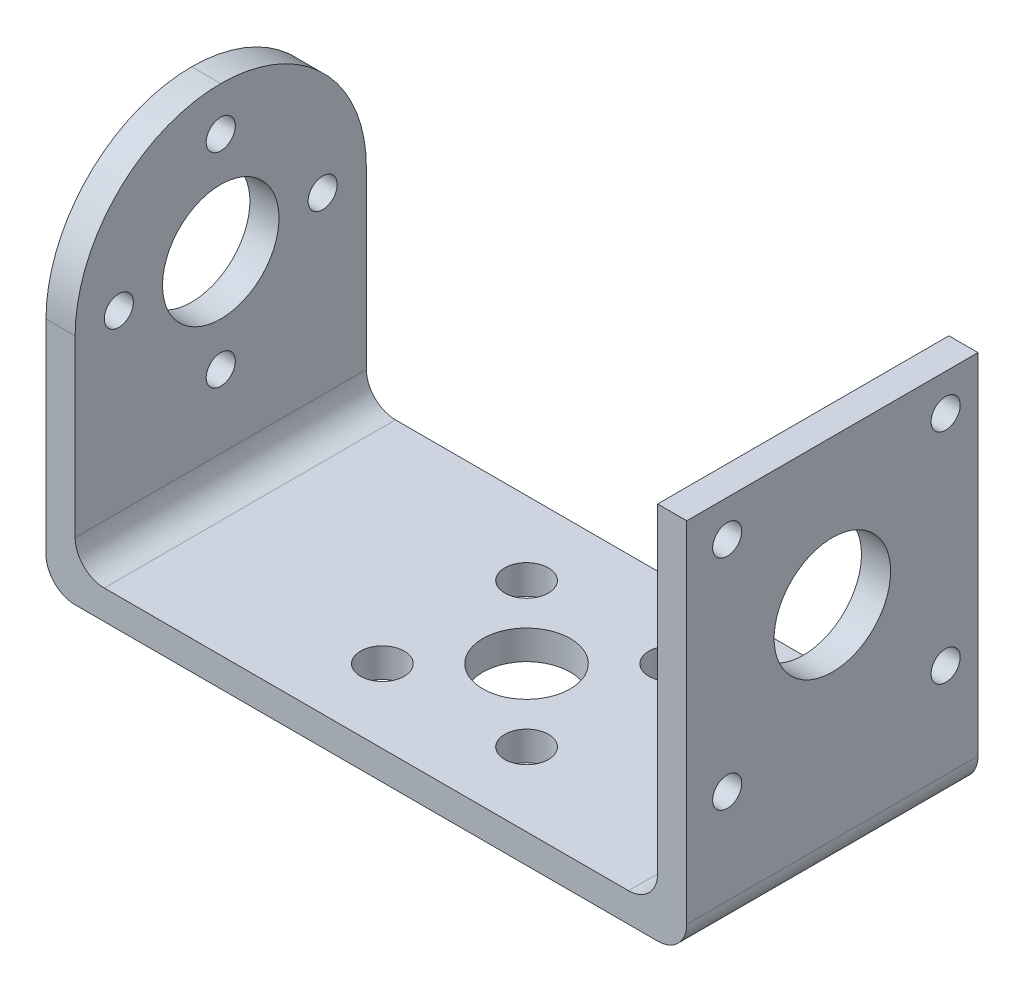
ISO-10303-21;
HEADER;
FILE_DESCRIPTION(('STEP AP214'),'2;1');
FILE_NAME('part.step','',(''),(''),'','','');
FILE_SCHEMA(('AUTOMOTIVE_DESIGN { 1 0 10303 214 1 1 1 1 }'));
ENDSEC;
DATA;
#1=APPLICATION_CONTEXT('core data for automotive mechanical design processes');
#2=APPLICATION_PROTOCOL_DEFINITION('international standard','automotive_design',2000,#1);
#3=PRODUCT_CONTEXT('',#1,'mechanical');
#4=PRODUCT('Part','Part','',(#3));
#5=PRODUCT_RELATED_PRODUCT_CATEGORY('part','',(#4));
#6=PRODUCT_DEFINITION_FORMATION('','',#4);
#7=PRODUCT_DEFINITION_CONTEXT('part definition',#1,'design');
#8=PRODUCT_DEFINITION('design','',#6,#7);
#9=PRODUCT_DEFINITION_SHAPE('','',#8);
#10=(LENGTH_UNIT() NAMED_UNIT(*) SI_UNIT(.MILLI.,.METRE.));
#11=(NAMED_UNIT(*) PLANE_ANGLE_UNIT() SI_UNIT($,.RADIAN.));
#12=(NAMED_UNIT(*) SI_UNIT($,.STERADIAN.) SOLID_ANGLE_UNIT());
#13=UNCERTAINTY_MEASURE_WITH_UNIT(LENGTH_MEASURE(1.E-05),#10,'distance_accuracy_value','');
#14=(GEOMETRIC_REPRESENTATION_CONTEXT(3) GLOBAL_UNCERTAINTY_ASSIGNED_CONTEXT((#13)) GLOBAL_UNIT_ASSIGNED_CONTEXT((#10,
#11,#12)) REPRESENTATION_CONTEXT('',''));
#15=CARTESIAN_POINT('',(0.,0.,0.));
#16=DIRECTION('',(0.,0.,1.));
#17=DIRECTION('',(1.,0.,0.));
#18=AXIS2_PLACEMENT_3D('',#15,#16,#17);
#19=CARTESIAN_POINT('',(44.0000000000001,0.,20.));
#20=DIRECTION('',(-1.,0.,0.));
#21=DIRECTION('',(0.,0.,1.));
#22=AXIS2_PLACEMENT_3D('',#19,#20,#21);
#23=PLANE('',#22);
#24=CARTESIAN_POINT('',(44.0000000000001,15.9999999999999,10.));
#25=DIRECTION('',(1.,0.,0.));
#26=DIRECTION('',(0.,0.,-1.));
#27=AXIS2_PLACEMENT_3D('',#24,#25,#26);
#28=CIRCLE('',#27,4.);
#29=CARTESIAN_POINT('',(44.0000000000001,15.9999999999999,6.));
#30=VERTEX_POINT('',#29);
#31=EDGE_CURVE('E172',#30,#30,#28,.T.);
#32=ORIENTED_EDGE('',*,*,#31,.F.);
#33=EDGE_LOOP('',(#32));
#34=FACE_BOUND('',#33,.T.);
#35=CARTESIAN_POINT('',(44.0000000000001,23.4999999999999,2.22182540694789));
#36=DIRECTION('',(1.,0.,0.));
#37=DIRECTION('',(0.,0.,-1.));
#38=AXIS2_PLACEMENT_3D('',#35,#36,#37);
#39=CIRCLE('',#38,0.999999999999998);
#40=CARTESIAN_POINT('',(44.0000000000001,23.4999999999999,1.2218254069479));
#41=VERTEX_POINT('',#40);
#42=EDGE_CURVE('E310',#41,#41,#39,.T.);
#43=ORIENTED_EDGE('',*,*,#42,.F.);
#44=EDGE_LOOP('',(#43));
#45=FACE_BOUND('',#44,.T.);
#46=CARTESIAN_POINT('',(44.0000000000001,8.49999999999986,2.22182540694789));
#47=DIRECTION('',(1.,0.,0.));
#48=DIRECTION('',(0.,0.,-1.));
#49=AXIS2_PLACEMENT_3D('',#46,#47,#48);
#50=CIRCLE('',#49,1.00000000000007);
#51=CARTESIAN_POINT('',(44.0000000000001,8.49999999999986,1.22182540694783));
#52=VERTEX_POINT('',#51);
#53=EDGE_CURVE('E306',#52,#52,#50,.T.);
#54=ORIENTED_EDGE('',*,*,#53,.F.);
#55=EDGE_LOOP('',(#54));
#56=FACE_BOUND('',#55,.T.);
#57=CARTESIAN_POINT('',(44.0000000000001,8.49999999999986,17.2218254069478));
#58=DIRECTION('',(1.,0.,0.));
#59=DIRECTION('',(0.,0.,-1.));
#60=AXIS2_PLACEMENT_3D('',#57,#58,#59);
#61=CIRCLE('',#60,1.);
#62=CARTESIAN_POINT('',(44.0000000000001,8.49999999999986,16.2218254069478));
#63=VERTEX_POINT('',#62);
#64=EDGE_CURVE('E303',#63,#63,#61,.T.);
#65=ORIENTED_EDGE('',*,*,#64,.F.);
#66=EDGE_LOOP('',(#65));
#67=FACE_BOUND('',#66,.T.);
#68=CARTESIAN_POINT('',(44.0000000000001,23.4999999999999,17.2218254069479));
#69=DIRECTION('',(1.,0.,0.));
#70=DIRECTION('',(0.,0.,-1.));
#71=AXIS2_PLACEMENT_3D('',#68,#69,#70);
#72=CIRCLE('',#71,0.999999999999998);
#73=CARTESIAN_POINT('',(44.0000000000001,23.4999999999999,16.2218254069479));
#74=VERTEX_POINT('',#73);
#75=EDGE_CURVE('E167',#74,#74,#72,.T.);
#76=ORIENTED_EDGE('',*,*,#75,.F.);
#77=EDGE_LOOP('',(#76));
#78=FACE_BOUND('',#77,.T.);
#79=DIRECTION('',(0.,1.,0.));
#80=VECTOR('',#79,1.);
#81=CARTESIAN_POINT('',(44.0000000000001,0.,20.));
#82=LINE('',#81,#80);
#83=CARTESIAN_POINT('',(44.0000000000001,2.,20.));
#84=VERTEX_POINT('',#83);
#85=CARTESIAN_POINT('',(44.0000000000001,26.,20.));
#86=VERTEX_POINT('',#85);
#87=EDGE_CURVE('E128',#84,#86,#82,.T.);
#88=ORIENTED_EDGE('',*,*,#87,.F.);
#89=DIRECTION('',(0.,0.,-1.));
#90=VECTOR('',#89,1.);
#91=CARTESIAN_POINT('',(44.0000000000001,2.,20.));
#92=LINE('',#91,#90);
#93=CARTESIAN_POINT('',(44.0000000000001,2.,0.));
#94=VERTEX_POINT('',#93);
#95=EDGE_CURVE('E219',#84,#94,#92,.T.);
#96=ORIENTED_EDGE('',*,*,#95,.T.);
#97=DIRECTION('',(0.,1.,0.));
#98=VECTOR('',#97,1.);
#99=CARTESIAN_POINT('',(44.0000000000001,0.,0.));
#100=LINE('',#99,#98);
#101=CARTESIAN_POINT('',(44.0000000000001,26.,0.));
#102=VERTEX_POINT('',#101);
#103=EDGE_CURVE('E153',#94,#102,#100,.T.);
#104=ORIENTED_EDGE('',*,*,#103,.T.);
#105=DIRECTION('',(0.,0.,-1.));
#106=VECTOR('',#105,1.);
#107=CARTESIAN_POINT('',(44.0000000000001,26.,20.));
#108=LINE('',#107,#106);
#109=EDGE_CURVE('E146',#86,#102,#108,.T.);
#110=ORIENTED_EDGE('',*,*,#109,.F.);
#111=EDGE_LOOP('',(#88,#96,#104,#110));
#112=FACE_BOUND('',#111,.T.);
#113=ADVANCED_FACE('F34',(#34,#45,#56,#67,#78,#112),#23,.F.);
#114=CARTESIAN_POINT('',(44.0000000000001,26.,20.));
#115=DIRECTION('',(0.,-1.,0.));
#116=DIRECTION('',(0.,0.,-1.));
#117=AXIS2_PLACEMENT_3D('',#114,#115,#116);
#118=PLANE('',#117);
#119=DIRECTION('',(-1.,0.,0.));
#120=VECTOR('',#119,1.);
#121=CARTESIAN_POINT('',(44.0000000000001,26.,0.));
#122=LINE('',#121,#120);
#123=CARTESIAN_POINT('',(42.0000000000001,26.,0.));
#124=VERTEX_POINT('',#123);
#125=EDGE_CURVE('E253',#102,#124,#122,.T.);
#126=ORIENTED_EDGE('',*,*,#125,.T.);
#127=DIRECTION('',(0.,0.,-1.));
#128=VECTOR('',#127,1.);
#129=CARTESIAN_POINT('',(42.0000000000001,26.,20.));
#130=LINE('',#129,#128);
#131=CARTESIAN_POINT('',(42.0000000000001,26.,20.));
#132=VERTEX_POINT('',#131);
#133=EDGE_CURVE('E148',#132,#124,#130,.T.);
#134=ORIENTED_EDGE('',*,*,#133,.F.);
#135=DIRECTION('',(-1.,0.,0.));
#136=VECTOR('',#135,1.);
#137=CARTESIAN_POINT('',(44.0000000000001,26.,20.));
#138=LINE('',#137,#136);
#139=EDGE_CURVE('E132',#86,#132,#138,.T.);
#140=ORIENTED_EDGE('',*,*,#139,.F.);
#141=ORIENTED_EDGE('',*,*,#109,.T.);
#142=EDGE_LOOP('',(#126,#134,#140,#141));
#143=FACE_BOUND('',#142,.T.);
#144=ADVANCED_FACE('F145',(#143),#118,.F.);
#145=CARTESIAN_POINT('',(42.0000000000001,26.,20.));
#146=DIRECTION('',(1.,0.,0.));
#147=DIRECTION('',(0.,1.,0.));
#148=AXIS2_PLACEMENT_3D('',#145,#146,#147);
#149=PLANE('',#148);
#150=CARTESIAN_POINT('',(42.0000000000001,15.9999999999999,10.));
#151=DIRECTION('',(1.,0.,0.));
#152=DIRECTION('',(0.,1.,0.));
#153=AXIS2_PLACEMENT_3D('',#150,#151,#152);
#154=CIRCLE('',#153,4.);
#155=CARTESIAN_POINT('',(42.0000000000001,19.9999999999999,10.));
#156=VERTEX_POINT('',#155);
#157=EDGE_CURVE('E178',#156,#156,#154,.T.);
#158=ORIENTED_EDGE('',*,*,#157,.T.);
#159=EDGE_LOOP('',(#158));
#160=FACE_BOUND('',#159,.T.);
#161=CARTESIAN_POINT('',(42.0000000000001,23.4999999999999,2.22182540694789));
#162=DIRECTION('',(1.,0.,0.));
#163=DIRECTION('',(0.,1.,0.));
#164=AXIS2_PLACEMENT_3D('',#161,#162,#163);
#165=CIRCLE('',#164,0.999999999999998);
#166=CARTESIAN_POINT('',(42.0000000000001,24.4999999999999,2.22182540694789));
#167=VERTEX_POINT('',#166);
#168=EDGE_CURVE('E175',#167,#167,#165,.T.);
#169=ORIENTED_EDGE('',*,*,#168,.T.);
#170=EDGE_LOOP('',(#169));
#171=FACE_BOUND('',#170,.T.);
#172=CARTESIAN_POINT('',(42.0000000000001,8.49999999999986,2.22182540694789));
#173=DIRECTION('',(1.,0.,0.));
#174=DIRECTION('',(0.,1.,0.));
#175=AXIS2_PLACEMENT_3D('',#172,#173,#174);
#176=CIRCLE('',#175,1.00000000000007);
#177=CARTESIAN_POINT('',(42.0000000000001,9.49999999999993,2.22182540694789));
#178=VERTEX_POINT('',#177);
#179=EDGE_CURVE('E171',#178,#178,#176,.T.);
#180=ORIENTED_EDGE('',*,*,#179,.T.);
#181=EDGE_LOOP('',(#180));
#182=FACE_BOUND('',#181,.T.);
#183=CARTESIAN_POINT('',(42.0000000000001,8.49999999999986,17.2218254069478));
#184=DIRECTION('',(1.,0.,0.));
#185=DIRECTION('',(0.,1.,0.));
#186=AXIS2_PLACEMENT_3D('',#183,#184,#185);
#187=CIRCLE('',#186,1.);
#188=CARTESIAN_POINT('',(42.0000000000001,9.49999999999986,17.2218254069478));
#189=VERTEX_POINT('',#188);
#190=EDGE_CURVE('E168',#189,#189,#187,.T.);
#191=ORIENTED_EDGE('',*,*,#190,.T.);
#192=EDGE_LOOP('',(#191));
#193=FACE_BOUND('',#192,.T.);
#194=CARTESIAN_POINT('',(42.0000000000001,23.4999999999999,17.2218254069479));
#195=DIRECTION('',(1.,0.,0.));
#196=DIRECTION('',(0.,1.,0.));
#197=AXIS2_PLACEMENT_3D('',#194,#195,#196);
#198=CIRCLE('',#197,0.999999999999998);
#199=CARTESIAN_POINT('',(42.0000000000001,24.4999999999999,17.2218254069479));
#200=VERTEX_POINT('',#199);
#201=EDGE_CURVE('E163',#200,#200,#198,.T.);
#202=ORIENTED_EDGE('',*,*,#201,.T.);
#203=EDGE_LOOP('',(#202));
#204=FACE_BOUND('',#203,.T.);
#205=DIRECTION('',(0.,-1.,0.));
#206=VECTOR('',#205,1.);
#207=CARTESIAN_POINT('',(42.0000000000001,26.,0.));
#208=LINE('',#207,#206);
#209=CARTESIAN_POINT('',(42.0000000000001,3.99999999999999,0.));
#210=VERTEX_POINT('',#209);
#211=EDGE_CURVE('E234',#124,#210,#208,.T.);
#212=ORIENTED_EDGE('',*,*,#211,.T.);
#213=DIRECTION('',(0.,0.,-1.));
#214=VECTOR('',#213,1.);
#215=CARTESIAN_POINT('',(42.0000000000001,3.99999999999999,20.));
#216=LINE('',#215,#214);
#217=CARTESIAN_POINT('',(42.0000000000001,3.99999999999999,20.));
#218=VERTEX_POINT('',#217);
#219=EDGE_CURVE('E214',#210,#218,#216,.F.);
#220=ORIENTED_EDGE('',*,*,#219,.T.);
#221=DIRECTION('',(0.,-1.,0.));
#222=VECTOR('',#221,1.);
#223=CARTESIAN_POINT('',(42.0000000000001,26.,20.));
#224=LINE('',#223,#222);
#225=EDGE_CURVE('E150',#132,#218,#224,.T.);
#226=ORIENTED_EDGE('',*,*,#225,.F.);
#227=ORIENTED_EDGE('',*,*,#133,.T.);
#228=EDGE_LOOP('',(#212,#220,#226,#227));
#229=FACE_BOUND('',#228,.T.);
#230=ADVANCED_FACE('F270',(#160,#171,#182,#193,#204,#229),#149,.F.);
#231=CARTESIAN_POINT('',(1.99999999999998,1.99999999999998,20.));
#232=DIRECTION('',(0.,-1.,0.));
#233=DIRECTION('',(1.,0.,0.));
#234=AXIS2_PLACEMENT_3D('',#231,#232,#233);
#235=PLANE('',#234);
#236=CARTESIAN_POINT('',(27.9497474683058,2.,14.9497474683058));
#237=DIRECTION('',(0.,-1.,0.));
#238=DIRECTION('',(0.,0.,-1.));
#239=AXIS2_PLACEMENT_3D('',#236,#237,#238);
#240=CIRCLE('',#239,1.49999999999993);
#241=CARTESIAN_POINT('',(27.9497474683058,2.,13.4497474683059));
#242=VERTEX_POINT('',#241);
#243=EDGE_CURVE('E318',#242,#242,#240,.T.);
#244=ORIENTED_EDGE('',*,*,#243,.T.);
#245=EDGE_LOOP('',(#244));
#246=FACE_BOUND('',#245,.T.);
#247=CARTESIAN_POINT('',(18.0502525316941,2.,14.9497474683059));
#248=DIRECTION('',(0.,-1.,0.));
#249=DIRECTION('',(0.,0.,-1.));
#250=AXIS2_PLACEMENT_3D('',#247,#248,#249);
#251=CIRCLE('',#250,1.5);
#252=CARTESIAN_POINT('',(18.0502525316941,2.,13.4497474683059));
#253=VERTEX_POINT('',#252);
#254=EDGE_CURVE('E335',#253,#253,#251,.T.);
#255=ORIENTED_EDGE('',*,*,#254,.T.);
#256=EDGE_LOOP('',(#255));
#257=FACE_BOUND('',#256,.T.);
#258=CARTESIAN_POINT('',(18.0502525316941,2.,5.05025253169416));
#259=DIRECTION('',(0.,-1.,0.));
#260=DIRECTION('',(0.,0.,-1.));
#261=AXIS2_PLACEMENT_3D('',#258,#259,#260);
#262=CIRCLE('',#261,1.49999999999996);
#263=CARTESIAN_POINT('',(18.0502525316941,2.,3.5502525316942));
#264=VERTEX_POINT('',#263);
#265=EDGE_CURVE('E329',#264,#264,#262,.T.);
#266=ORIENTED_EDGE('',*,*,#265,.T.);
#267=EDGE_LOOP('',(#266));
#268=FACE_BOUND('',#267,.T.);
#269=CARTESIAN_POINT('',(27.9497474683058,2.,5.05025253169417));
#270=DIRECTION('',(0.,-1.,0.));
#271=DIRECTION('',(0.,0.,-1.));
#272=AXIS2_PLACEMENT_3D('',#269,#270,#271);
#273=CIRCLE('',#272,1.5);
#274=CARTESIAN_POINT('',(27.9497474683058,2.,3.55025253169417));
#275=VERTEX_POINT('',#274);
#276=EDGE_CURVE('E323',#275,#275,#273,.T.);
#277=ORIENTED_EDGE('',*,*,#276,.T.);
#278=EDGE_LOOP('',(#277));
#279=FACE_BOUND('',#278,.T.);
#280=CARTESIAN_POINT('',(22.9999999999999,2.,10.));
#281=DIRECTION('',(0.,-1.,0.));
#282=DIRECTION('',(0.,0.,-1.));
#283=AXIS2_PLACEMENT_3D('',#280,#281,#282);
#284=CIRCLE('',#283,3.);
#285=CARTESIAN_POINT('',(22.9999999999999,2.,7.));
#286=VERTEX_POINT('',#285);
#287=EDGE_CURVE('E307',#286,#286,#284,.T.);
#288=ORIENTED_EDGE('',*,*,#287,.T.);
#289=EDGE_LOOP('',(#288));
#290=FACE_BOUND('',#289,.T.);
#291=DIRECTION('',(-1.,0.,0.));
#292=VECTOR('',#291,1.);
#293=CARTESIAN_POINT('',(1.99999999999998,1.99999999999998,20.));
#294=LINE('',#293,#292);
#295=CARTESIAN_POINT('',(40.0000000000001,1.99999999999999,20.));
#296=VERTEX_POINT('',#295);
#297=CARTESIAN_POINT('',(3.99999999999998,1.99999999999998,20.));
#298=VERTEX_POINT('',#297);
#299=EDGE_CURVE('E240',#296,#298,#294,.T.);
#300=ORIENTED_EDGE('',*,*,#299,.F.);
#301=DIRECTION('',(0.,0.,-1.));
#302=VECTOR('',#301,1.);
#303=CARTESIAN_POINT('',(40.0000000000001,1.99999999999999,0.));
#304=LINE('',#303,#302);
#305=CARTESIAN_POINT('',(40.0000000000001,1.99999999999999,0.));
#306=VERTEX_POINT('',#305);
#307=EDGE_CURVE('E211',#296,#306,#304,.T.);
#308=ORIENTED_EDGE('',*,*,#307,.T.);
#309=DIRECTION('',(-1.,0.,0.));
#310=VECTOR('',#309,1.);
#311=CARTESIAN_POINT('',(1.99999999999998,1.99999999999998,0.));
#312=LINE('',#311,#310);
#313=CARTESIAN_POINT('',(3.99999999999998,1.99999999999998,0.));
#314=VERTEX_POINT('',#313);
#315=EDGE_CURVE('E228',#306,#314,#312,.T.);
#316=ORIENTED_EDGE('',*,*,#315,.T.);
#317=DIRECTION('',(0.,0.,-1.));
#318=VECTOR('',#317,1.);
#319=CARTESIAN_POINT('',(3.99999999999998,1.99999999999998,20.));
#320=LINE('',#319,#318);
#321=EDGE_CURVE('E49',#314,#298,#320,.F.);
#322=ORIENTED_EDGE('',*,*,#321,.T.);
#323=EDGE_LOOP('',(#300,#308,#316,#322));
#324=FACE_BOUND('',#323,.T.);
#325=ADVANCED_FACE('F232',(#246,#257,#268,#279,#290,#324),#235,.F.);
#326=CARTESIAN_POINT('',(1.99999999999998,1.99999999999998,20.));
#327=DIRECTION('',(-1.,0.,0.));
#328=DIRECTION('',(0.,0.,1.));
#329=AXIS2_PLACEMENT_3D('',#326,#327,#328);
#330=PLANE('',#329);
#331=CARTESIAN_POINT('',(1.99999999999999,16.,3.));
#332=DIRECTION('',(-1.,0.,0.));
#333=DIRECTION('',(0.,0.,1.));
#334=AXIS2_PLACEMENT_3D('',#331,#332,#333);
#335=CIRCLE('',#334,0.999999999999827);
#336=CARTESIAN_POINT('',(1.99999999999999,16.,3.99999999999982));
#337=VERTEX_POINT('',#336);
#338=EDGE_CURVE('E293',#337,#337,#335,.T.);
#339=ORIENTED_EDGE('',*,*,#338,.T.);
#340=EDGE_LOOP('',(#339));
#341=FACE_BOUND('',#340,.T.);
#342=CARTESIAN_POINT('',(1.99999999999999,8.99999999999999,10.));
#343=DIRECTION('',(-1.,0.,0.));
#344=DIRECTION('',(0.,0.,1.));
#345=AXIS2_PLACEMENT_3D('',#342,#343,#344);
#346=CIRCLE('',#345,0.99999999999967);
#347=CARTESIAN_POINT('',(1.99999999999999,8.99999999999999,10.9999999999997));
#348=VERTEX_POINT('',#347);
#349=EDGE_CURVE('E283',#348,#348,#346,.T.);
#350=ORIENTED_EDGE('',*,*,#349,.T.);
#351=EDGE_LOOP('',(#350));
#352=FACE_BOUND('',#351,.T.);
#353=CARTESIAN_POINT('',(1.99999999999999,16.,17.));
#354=DIRECTION('',(-1.,0.,0.));
#355=DIRECTION('',(0.,0.,1.));
#356=AXIS2_PLACEMENT_3D('',#353,#354,#355);
#357=CIRCLE('',#356,0.999999999999888);
#358=CARTESIAN_POINT('',(1.99999999999999,16.,17.9999999999999));
#359=VERTEX_POINT('',#358);
#360=EDGE_CURVE('E282',#359,#359,#357,.T.);
#361=ORIENTED_EDGE('',*,*,#360,.T.);
#362=EDGE_LOOP('',(#361));
#363=FACE_BOUND('',#362,.T.);
#364=CARTESIAN_POINT('',(1.99999999999999,23.,10.));
#365=DIRECTION('',(-1.,0.,0.));
#366=DIRECTION('',(0.,0.,1.));
#367=AXIS2_PLACEMENT_3D('',#364,#365,#366);
#368=CIRCLE('',#367,1.);
#369=CARTESIAN_POINT('',(1.99999999999999,23.,11.));
#370=VERTEX_POINT('',#369);
#371=EDGE_CURVE('E276',#370,#370,#368,.T.);
#372=ORIENTED_EDGE('',*,*,#371,.T.);
#373=EDGE_LOOP('',(#372));
#374=FACE_BOUND('',#373,.T.);
#375=CARTESIAN_POINT('',(1.99999999999999,16.,10.));
#376=DIRECTION('',(-1.,0.,0.));
#377=DIRECTION('',(0.,0.,1.));
#378=AXIS2_PLACEMENT_3D('',#375,#376,#377);
#379=CIRCLE('',#378,4.);
#380=CARTESIAN_POINT('',(1.99999999999999,16.,14.));
#381=VERTEX_POINT('',#380);
#382=EDGE_CURVE('E254',#381,#381,#379,.T.);
#383=ORIENTED_EDGE('',*,*,#382,.T.);
#384=EDGE_LOOP('',(#383));
#385=FACE_BOUND('',#384,.T.);
#386=DIRECTION('',(0.,1.,0.));
#387=VECTOR('',#386,1.);
#388=CARTESIAN_POINT('',(1.99999999999998,1.99999999999998,20.));
#389=LINE('',#388,#387);
#390=CARTESIAN_POINT('',(1.99999999999998,3.99999999999998,20.));
#391=VERTEX_POINT('',#390);
#392=CARTESIAN_POINT('',(1.99999999999998,16.,20.));
#393=VERTEX_POINT('',#392);
#394=EDGE_CURVE('E239',#391,#393,#389,.T.);
#395=ORIENTED_EDGE('',*,*,#394,.F.);
#396=DIRECTION('',(0.,0.,-1.));
#397=VECTOR('',#396,1.);
#398=CARTESIAN_POINT('',(1.99999999999998,3.99999999999998,0.));
#399=LINE('',#398,#397);
#400=CARTESIAN_POINT('',(1.99999999999998,3.99999999999998,0.));
#401=VERTEX_POINT('',#400);
#402=EDGE_CURVE('E216',#391,#401,#399,.T.);
#403=ORIENTED_EDGE('',*,*,#402,.T.);
#404=DIRECTION('',(0.,1.,0.));
#405=VECTOR('',#404,1.);
#406=CARTESIAN_POINT('',(1.99999999999998,1.99999999999998,0.));
#407=LINE('',#406,#405);
#408=CARTESIAN_POINT('',(1.99999999999998,16.,0.));
#409=VERTEX_POINT('',#408);
#410=EDGE_CURVE('E229',#401,#409,#407,.T.);
#411=ORIENTED_EDGE('',*,*,#410,.T.);
#412=CARTESIAN_POINT('',(1.99999999999998,16.,10.));
#413=DIRECTION('',(-1.,0.,0.));
#414=DIRECTION('',(0.,0.,1.));
#415=AXIS2_PLACEMENT_3D('',#412,#413,#414);
#416=CIRCLE('',#415,10.);
#417=CARTESIAN_POINT('',(1.99999999999998,26.,10.));
#418=VERTEX_POINT('',#417);
#419=EDGE_CURVE('E188',#409,#418,#416,.F.);
#420=ORIENTED_EDGE('',*,*,#419,.T.);
#421=CARTESIAN_POINT('',(1.99999999999998,16.,10.));
#422=DIRECTION('',(-1.,0.,0.));
#423=DIRECTION('',(0.,0.,1.));
#424=AXIS2_PLACEMENT_3D('',#421,#422,#423);
#425=CIRCLE('',#424,10.);
#426=EDGE_CURVE('E185',#418,#393,#425,.F.);
#427=ORIENTED_EDGE('',*,*,#426,.T.);
#428=EDGE_LOOP('',(#395,#403,#411,#420,#427));
#429=FACE_BOUND('',#428,.T.);
#430=ADVANCED_FACE('F242',(#341,#352,#363,#374,#385,#429),#330,.F.);
#431=CARTESIAN_POINT('',(1.11022302462516E-13,26.,20.));
#432=DIRECTION('',(1.,0.,0.));
#433=DIRECTION('',(0.,1.,0.));
#434=AXIS2_PLACEMENT_3D('',#431,#432,#433);
#435=PLANE('',#434);
#436=CARTESIAN_POINT('',(0.,16.,3.));
#437=DIRECTION('',(-1.,0.,0.));
#438=DIRECTION('',(0.,0.,1.));
#439=AXIS2_PLACEMENT_3D('',#436,#437,#438);
#440=CIRCLE('',#439,0.999999999999827);
#441=CARTESIAN_POINT('',(0.,16.,3.99999999999982));
#442=VERTEX_POINT('',#441);
#443=EDGE_CURVE('E166',#442,#442,#440,.T.);
#444=ORIENTED_EDGE('',*,*,#443,.F.);
#445=EDGE_LOOP('',(#444));
#446=FACE_BOUND('',#445,.T.);
#447=CARTESIAN_POINT('',(0.,8.99999999999999,10.));
#448=DIRECTION('',(-1.,0.,0.));
#449=DIRECTION('',(0.,0.,1.));
#450=AXIS2_PLACEMENT_3D('',#447,#448,#449);
#451=CIRCLE('',#450,0.99999999999967);
#452=CARTESIAN_POINT('',(0.,8.99999999999999,10.9999999999997));
#453=VERTEX_POINT('',#452);
#454=EDGE_CURVE('E296',#453,#453,#451,.T.);
#455=ORIENTED_EDGE('',*,*,#454,.F.);
#456=EDGE_LOOP('',(#455));
#457=FACE_BOUND('',#456,.T.);
#458=CARTESIAN_POINT('',(0.,16.,17.));
#459=DIRECTION('',(-1.,0.,0.));
#460=DIRECTION('',(0.,0.,1.));
#461=AXIS2_PLACEMENT_3D('',#458,#459,#460);
#462=CIRCLE('',#461,0.999999999999888);
#463=CARTESIAN_POINT('',(0.,16.,17.9999999999999));
#464=VERTEX_POINT('',#463);
#465=EDGE_CURVE('E279',#464,#464,#462,.T.);
#466=ORIENTED_EDGE('',*,*,#465,.F.);
#467=EDGE_LOOP('',(#466));
#468=FACE_BOUND('',#467,.T.);
#469=CARTESIAN_POINT('',(0.,23.,10.));
#470=DIRECTION('',(-1.,0.,0.));
#471=DIRECTION('',(0.,0.,1.));
#472=AXIS2_PLACEMENT_3D('',#469,#470,#471);
#473=CIRCLE('',#472,1.);
#474=CARTESIAN_POINT('',(0.,23.,11.));
#475=VERTEX_POINT('',#474);
#476=EDGE_CURVE('E286',#475,#475,#473,.T.);
#477=ORIENTED_EDGE('',*,*,#476,.F.);
#478=EDGE_LOOP('',(#477));
#479=FACE_BOUND('',#478,.T.);
#480=CARTESIAN_POINT('',(0.,16.,10.));
#481=DIRECTION('',(-1.,0.,0.));
#482=DIRECTION('',(0.,0.,1.));
#483=AXIS2_PLACEMENT_3D('',#480,#481,#482);
#484=CIRCLE('',#483,4.);
#485=CARTESIAN_POINT('',(0.,16.,14.));
#486=VERTEX_POINT('',#485);
#487=EDGE_CURVE('E273',#486,#486,#484,.T.);
#488=ORIENTED_EDGE('',*,*,#487,.F.);
#489=EDGE_LOOP('',(#488));
#490=FACE_BOUND('',#489,.T.);
#491=DIRECTION('',(0.,-1.,0.));
#492=VECTOR('',#491,1.);
#493=CARTESIAN_POINT('',(1.11022302462516E-13,26.,0.));
#494=LINE('',#493,#492);
#495=CARTESIAN_POINT('',(1.12356705136344E-13,16.,0.));
#496=VERTEX_POINT('',#495);
#497=CARTESIAN_POINT('',(1.14224868879704E-13,2.00000000000001,0.));
#498=VERTEX_POINT('',#497);
#499=EDGE_CURVE('E259',#496,#498,#494,.T.);
#500=ORIENTED_EDGE('',*,*,#499,.T.);
#501=DIRECTION('',(0.,0.,-1.));
#502=VECTOR('',#501,1.);
#503=CARTESIAN_POINT('',(1.14224868879704E-13,2.,20.));
#504=LINE('',#503,#502);
#505=CARTESIAN_POINT('',(1.14224868879704E-13,2.00000000000001,20.));
#506=VERTEX_POINT('',#505);
#507=EDGE_CURVE('E205',#498,#506,#504,.F.);
#508=ORIENTED_EDGE('',*,*,#507,.T.);
#509=DIRECTION('',(0.,-1.,0.));
#510=VECTOR('',#509,1.);
#511=CARTESIAN_POINT('',(1.11022302462516E-13,26.,20.));
#512=LINE('',#511,#510);
#513=CARTESIAN_POINT('',(1.12356705136344E-13,16.,20.));
#514=VERTEX_POINT('',#513);
#515=EDGE_CURVE('E245',#514,#506,#512,.T.);
#516=ORIENTED_EDGE('',*,*,#515,.F.);
#517=CARTESIAN_POINT('',(1.12356705136344E-13,16.,10.));
#518=DIRECTION('',(1.,0.,0.));
#519=DIRECTION('',(0.,1.,0.));
#520=AXIS2_PLACEMENT_3D('',#517,#518,#519);
#521=CIRCLE('',#520,10.);
#522=CARTESIAN_POINT('',(1.11022302462516E-13,26.,10.));
#523=VERTEX_POINT('',#522);
#524=EDGE_CURVE('E155',#514,#523,#521,.F.);
#525=ORIENTED_EDGE('',*,*,#524,.T.);
#526=CARTESIAN_POINT('',(1.12323345069498E-13,16.,10.));
#527=DIRECTION('',(1.,0.,0.));
#528=DIRECTION('',(0.,1.,0.));
#529=AXIS2_PLACEMENT_3D('',#526,#527,#528);
#530=CIRCLE('',#529,10.);
#531=EDGE_CURVE('E157',#523,#496,#530,.F.);
#532=ORIENTED_EDGE('',*,*,#531,.T.);
#533=EDGE_LOOP('',(#500,#508,#516,#525,#532));
#534=FACE_BOUND('',#533,.T.);
#535=ADVANCED_FACE('F356',(#446,#457,#468,#479,#490,#534),#435,.F.);
#536=CARTESIAN_POINT('',(1.14491749414469E-13,0.,20.));
#537=DIRECTION('',(0.,1.,0.));
#538=DIRECTION('',(0.,0.,1.));
#539=AXIS2_PLACEMENT_3D('',#536,#537,#538);
#540=PLANE('',#539);
#541=CARTESIAN_POINT('',(27.9497474683058,0.,14.9497474683058));
#542=DIRECTION('',(0.,-1.,0.));
#543=DIRECTION('',(0.,0.,-1.));
#544=AXIS2_PLACEMENT_3D('',#541,#542,#543);
#545=CIRCLE('',#544,1.49999999999993);
#546=CARTESIAN_POINT('',(27.9497474683058,0.,13.4497474683059));
#547=VERTEX_POINT('',#546);
#548=EDGE_CURVE('E338',#547,#547,#545,.T.);
#549=ORIENTED_EDGE('',*,*,#548,.F.);
#550=EDGE_LOOP('',(#549));
#551=FACE_BOUND('',#550,.T.);
#552=CARTESIAN_POINT('',(18.0502525316941,0.,14.9497474683059));
#553=DIRECTION('',(0.,-1.,0.));
#554=DIRECTION('',(0.,0.,-1.));
#555=AXIS2_PLACEMENT_3D('',#552,#553,#554);
#556=CIRCLE('',#555,1.5);
#557=CARTESIAN_POINT('',(18.0502525316941,0.,13.4497474683059));
#558=VERTEX_POINT('',#557);
#559=EDGE_CURVE('E332',#558,#558,#556,.T.);
#560=ORIENTED_EDGE('',*,*,#559,.F.);
#561=EDGE_LOOP('',(#560));
#562=FACE_BOUND('',#561,.T.);
#563=CARTESIAN_POINT('',(18.0502525316941,0.,5.05025253169416));
#564=DIRECTION('',(0.,-1.,0.));
#565=DIRECTION('',(0.,0.,-1.));
#566=AXIS2_PLACEMENT_3D('',#563,#564,#565);
#567=CIRCLE('',#566,1.49999999999996);
#568=CARTESIAN_POINT('',(18.0502525316941,0.,3.5502525316942));
#569=VERTEX_POINT('',#568);
#570=EDGE_CURVE('E326',#569,#569,#567,.T.);
#571=ORIENTED_EDGE('',*,*,#570,.F.);
#572=EDGE_LOOP('',(#571));
#573=FACE_BOUND('',#572,.T.);
#574=CARTESIAN_POINT('',(27.9497474683058,0.,5.05025253169417));
#575=DIRECTION('',(0.,-1.,0.));
#576=DIRECTION('',(0.,0.,-1.));
#577=AXIS2_PLACEMENT_3D('',#574,#575,#576);
#578=CIRCLE('',#577,1.5);
#579=CARTESIAN_POINT('',(27.9497474683058,0.,3.55025253169417));
#580=VERTEX_POINT('',#579);
#581=EDGE_CURVE('E196',#580,#580,#578,.T.);
#582=ORIENTED_EDGE('',*,*,#581,.F.);
#583=EDGE_LOOP('',(#582));
#584=FACE_BOUND('',#583,.T.);
#585=CARTESIAN_POINT('',(22.9999999999999,0.,10.));
#586=DIRECTION('',(0.,-1.,0.));
#587=DIRECTION('',(0.,0.,-1.));
#588=AXIS2_PLACEMENT_3D('',#585,#586,#587);
#589=CIRCLE('',#588,3.);
#590=CARTESIAN_POINT('',(22.9999999999999,0.,7.));
#591=VERTEX_POINT('',#590);
#592=EDGE_CURVE('E315',#591,#591,#589,.T.);
#593=ORIENTED_EDGE('',*,*,#592,.F.);
#594=EDGE_LOOP('',(#593));
#595=FACE_BOUND('',#594,.T.);
#596=DIRECTION('',(1.,0.,0.));
#597=VECTOR('',#596,1.);
#598=CARTESIAN_POINT('',(1.14491749414469E-13,0.,20.));
#599=LINE('',#598,#597);
#600=CARTESIAN_POINT('',(2.00000000000011,0.,20.));
#601=VERTEX_POINT('',#600);
#602=CARTESIAN_POINT('',(42.0000000000001,0.,20.));
#603=VERTEX_POINT('',#602);
#604=EDGE_CURVE('E159',#601,#603,#599,.T.);
#605=ORIENTED_EDGE('',*,*,#604,.F.);
#606=DIRECTION('',(0.,0.,-1.));
#607=VECTOR('',#606,1.);
#608=CARTESIAN_POINT('',(2.00000000000011,0.,20.));
#609=LINE('',#608,#607);
#610=CARTESIAN_POINT('',(2.00000000000011,0.,0.));
#611=VERTEX_POINT('',#610);
#612=EDGE_CURVE('E198',#601,#611,#609,.T.);
#613=ORIENTED_EDGE('',*,*,#612,.T.);
#614=DIRECTION('',(1.,0.,0.));
#615=VECTOR('',#614,1.);
#616=CARTESIAN_POINT('',(1.14491749414469E-13,0.,0.));
#617=LINE('',#616,#615);
#618=CARTESIAN_POINT('',(42.0000000000001,0.,0.));
#619=VERTEX_POINT('',#618);
#620=EDGE_CURVE('E141',#611,#619,#617,.T.);
#621=ORIENTED_EDGE('',*,*,#620,.T.);
#622=DIRECTION('',(0.,0.,-1.));
#623=VECTOR('',#622,1.);
#624=CARTESIAN_POINT('',(42.0000000000001,0.,20.));
#625=LINE('',#624,#623);
#626=EDGE_CURVE('E192',#619,#603,#625,.F.);
#627=ORIENTED_EDGE('',*,*,#626,.T.);
#628=EDGE_LOOP('',(#605,#613,#621,#627));
#629=FACE_BOUND('',#628,.T.);
#630=ADVANCED_FACE('F265',(#551,#562,#573,#584,#595,#629),#540,.F.);
#631=CARTESIAN_POINT('',(0.,0.,20.));
#632=DIRECTION('',(0.,0.,1.));
#633=DIRECTION('',(1.,0.,0.));
#634=AXIS2_PLACEMENT_3D('',#631,#632,#633);
#635=PLANE('',#634);
#636=ORIENTED_EDGE('',*,*,#515,.T.);
#637=CARTESIAN_POINT('',(2.00000000000011,2.,20.));
#638=DIRECTION('',(0.,0.,1.));
#639=DIRECTION('',(1.,0.,0.));
#640=AXIS2_PLACEMENT_3D('',#637,#638,#639);
#641=CIRCLE('',#640,2.);
#642=EDGE_CURVE('E208',#506,#601,#641,.T.);
#643=ORIENTED_EDGE('',*,*,#642,.T.);
#644=ORIENTED_EDGE('',*,*,#604,.T.);
#645=CARTESIAN_POINT('',(42.0000000000001,2.,20.));
#646=DIRECTION('',(0.,0.,1.));
#647=DIRECTION('',(1.,0.,0.));
#648=AXIS2_PLACEMENT_3D('',#645,#646,#647);
#649=CIRCLE('',#648,2.);
#650=EDGE_CURVE('E136',#603,#84,#649,.T.);
#651=ORIENTED_EDGE('',*,*,#650,.T.);
#652=ORIENTED_EDGE('',*,*,#87,.T.);
#653=ORIENTED_EDGE('',*,*,#139,.T.);
#654=ORIENTED_EDGE('',*,*,#225,.T.);
#655=CARTESIAN_POINT('',(40.0000000000001,3.99999999999999,20.));
#656=DIRECTION('',(0.,0.,1.));
#657=DIRECTION('',(1.,0.,0.));
#658=AXIS2_PLACEMENT_3D('',#655,#656,#657);
#659=CIRCLE('',#658,2.);
#660=EDGE_CURVE('E56',#218,#296,#659,.F.);
#661=ORIENTED_EDGE('',*,*,#660,.T.);
#662=ORIENTED_EDGE('',*,*,#299,.T.);
#663=CARTESIAN_POINT('',(3.99999999999998,3.99999999999998,20.));
#664=DIRECTION('',(0.,0.,1.));
#665=DIRECTION('',(1.,0.,0.));
#666=AXIS2_PLACEMENT_3D('',#663,#664,#665);
#667=CIRCLE('',#666,2.);
#668=EDGE_CURVE('E11',#298,#391,#667,.F.);
#669=ORIENTED_EDGE('',*,*,#668,.T.);
#670=ORIENTED_EDGE('',*,*,#394,.T.);
#671=DIRECTION('',(-1.,0.,0.));
#672=VECTOR('',#671,1.);
#673=CARTESIAN_POINT('',(1.11022302462516E-13,16.,20.));
#674=LINE('',#673,#672);
#675=EDGE_CURVE('E190',#393,#514,#674,.T.);
#676=ORIENTED_EDGE('',*,*,#675,.T.);
#677=EDGE_LOOP('',(#636,#643,#644,#651,#652,#653,#654,#661,#662,#669,#670,#676));
#678=FACE_BOUND('',#677,.T.);
#679=ADVANCED_FACE('F131',(#678),#635,.T.);
#680=CARTESIAN_POINT('',(0.,0.,0.));
#681=DIRECTION('',(0.,0.,1.));
#682=DIRECTION('',(1.,0.,0.));
#683=AXIS2_PLACEMENT_3D('',#680,#681,#682);
#684=PLANE('',#683);
#685=ORIENTED_EDGE('',*,*,#620,.F.);
#686=CARTESIAN_POINT('',(2.00000000000011,2.,0.));
#687=DIRECTION('',(0.,0.,1.));
#688=DIRECTION('',(1.,0.,0.));
#689=AXIS2_PLACEMENT_3D('',#686,#687,#688);
#690=CIRCLE('',#689,2.);
#691=EDGE_CURVE('E203',#611,#498,#690,.F.);
#692=ORIENTED_EDGE('',*,*,#691,.T.);
#693=ORIENTED_EDGE('',*,*,#499,.F.);
#694=DIRECTION('',(-1.,0.,0.));
#695=VECTOR('',#694,1.);
#696=CARTESIAN_POINT('',(0.,16.,0.));
#697=LINE('',#696,#695);
#698=EDGE_CURVE('E182',#496,#409,#697,.F.);
#699=ORIENTED_EDGE('',*,*,#698,.T.);
#700=ORIENTED_EDGE('',*,*,#410,.F.);
#701=CARTESIAN_POINT('',(3.99999999999998,3.99999999999998,0.));
#702=DIRECTION('',(0.,0.,1.));
#703=DIRECTION('',(1.,0.,0.));
#704=AXIS2_PLACEMENT_3D('',#701,#702,#703);
#705=CIRCLE('',#704,2.);
#706=EDGE_CURVE('E42',#401,#314,#705,.T.);
#707=ORIENTED_EDGE('',*,*,#706,.T.);
#708=ORIENTED_EDGE('',*,*,#315,.F.);
#709=CARTESIAN_POINT('',(40.0000000000001,3.99999999999999,0.));
#710=DIRECTION('',(0.,0.,1.));
#711=DIRECTION('',(1.,0.,0.));
#712=AXIS2_PLACEMENT_3D('',#709,#710,#711);
#713=CIRCLE('',#712,2.);
#714=EDGE_CURVE('E221',#306,#210,#713,.T.);
#715=ORIENTED_EDGE('',*,*,#714,.T.);
#716=ORIENTED_EDGE('',*,*,#211,.F.);
#717=ORIENTED_EDGE('',*,*,#125,.F.);
#718=ORIENTED_EDGE('',*,*,#103,.F.);
#719=CARTESIAN_POINT('',(42.0000000000001,2.,0.));
#720=DIRECTION('',(0.,0.,1.));
#721=DIRECTION('',(1.,0.,0.));
#722=AXIS2_PLACEMENT_3D('',#719,#720,#721);
#723=CIRCLE('',#722,2.);
#724=EDGE_CURVE('E201',#94,#619,#723,.F.);
#725=ORIENTED_EDGE('',*,*,#724,.T.);
#726=EDGE_LOOP('',(#685,#692,#693,#699,#700,#707,#708,#715,#716,#717,#718,#725));
#727=FACE_BOUND('',#726,.T.);
#728=ADVANCED_FACE('F227',(#727),#684,.F.);
#729=CARTESIAN_POINT('',(1.99999999999999,16.,10.));
#730=DIRECTION('',(-1.,0.,0.));
#731=DIRECTION('',(0.,0.,1.));
#732=AXIS2_PLACEMENT_3D('',#729,#730,#731);
#733=CYLINDRICAL_SURFACE('',#732,4.);
#734=ORIENTED_EDGE('',*,*,#382,.F.);
#735=EDGE_LOOP('',(#734));
#736=FACE_BOUND('',#735,.T.);
#737=ORIENTED_EDGE('',*,*,#487,.T.);
#738=EDGE_LOOP('',(#737));
#739=FACE_BOUND('',#738,.T.);
#740=ADVANCED_FACE('F440',(#736,#739),#733,.F.);
#741=CARTESIAN_POINT('',(1.99999999999999,23.,10.));
#742=DIRECTION('',(-1.,0.,0.));
#743=DIRECTION('',(0.,0.,1.));
#744=AXIS2_PLACEMENT_3D('',#741,#742,#743);
#745=CYLINDRICAL_SURFACE('',#744,1.);
#746=ORIENTED_EDGE('',*,*,#371,.F.);
#747=EDGE_LOOP('',(#746));
#748=FACE_BOUND('',#747,.T.);
#749=ORIENTED_EDGE('',*,*,#476,.T.);
#750=EDGE_LOOP('',(#749));
#751=FACE_BOUND('',#750,.T.);
#752=ADVANCED_FACE('F615',(#748,#751),#745,.F.);
#753=CARTESIAN_POINT('',(1.99999999999999,16.,17.));
#754=DIRECTION('',(-1.,0.,0.));
#755=DIRECTION('',(0.,0.,1.));
#756=AXIS2_PLACEMENT_3D('',#753,#754,#755);
#757=CYLINDRICAL_SURFACE('',#756,0.999999999999888);
#758=ORIENTED_EDGE('',*,*,#360,.F.);
#759=EDGE_LOOP('',(#758));
#760=FACE_BOUND('',#759,.T.);
#761=ORIENTED_EDGE('',*,*,#465,.T.);
#762=EDGE_LOOP('',(#761));
#763=FACE_BOUND('',#762,.T.);
#764=ADVANCED_FACE('F605',(#760,#763),#757,.F.);
#765=CARTESIAN_POINT('',(1.99999999999999,8.99999999999999,10.));
#766=DIRECTION('',(-1.,0.,0.));
#767=DIRECTION('',(0.,0.,1.));
#768=AXIS2_PLACEMENT_3D('',#765,#766,#767);
#769=CYLINDRICAL_SURFACE('',#768,0.99999999999967);
#770=ORIENTED_EDGE('',*,*,#349,.F.);
#771=EDGE_LOOP('',(#770));
#772=FACE_BOUND('',#771,.T.);
#773=ORIENTED_EDGE('',*,*,#454,.T.);
#774=EDGE_LOOP('',(#773));
#775=FACE_BOUND('',#774,.T.);
#776=ADVANCED_FACE('F595',(#772,#775),#769,.F.);
#777=CARTESIAN_POINT('',(1.99999999999999,16.,3.));
#778=DIRECTION('',(-1.,0.,0.));
#779=DIRECTION('',(0.,0.,1.));
#780=AXIS2_PLACEMENT_3D('',#777,#778,#779);
#781=CYLINDRICAL_SURFACE('',#780,0.999999999999827);
#782=ORIENTED_EDGE('',*,*,#338,.F.);
#783=EDGE_LOOP('',(#782));
#784=FACE_BOUND('',#783,.T.);
#785=ORIENTED_EDGE('',*,*,#443,.T.);
#786=EDGE_LOOP('',(#785));
#787=FACE_BOUND('',#786,.T.);
#788=ADVANCED_FACE('F585',(#784,#787),#781,.F.);
#789=CARTESIAN_POINT('',(24.0000000000001,23.4999999999999,17.2218254069479));
#790=DIRECTION('',(1.,0.,0.));
#791=DIRECTION('',(0.,0.,-1.));
#792=AXIS2_PLACEMENT_3D('',#789,#790,#791);
#793=CYLINDRICAL_SURFACE('',#792,0.999999999999998);
#794=ORIENTED_EDGE('',*,*,#75,.T.);
#795=EDGE_LOOP('',(#794));
#796=FACE_BOUND('',#795,.T.);
#797=ORIENTED_EDGE('',*,*,#201,.F.);
#798=EDGE_LOOP('',(#797));
#799=FACE_BOUND('',#798,.T.);
#800=ADVANCED_FACE('F575',(#796,#799),#793,.F.);
#801=CARTESIAN_POINT('',(24.0000000000001,8.49999999999986,17.2218254069478));
#802=DIRECTION('',(1.,0.,0.));
#803=DIRECTION('',(0.,0.,-1.));
#804=AXIS2_PLACEMENT_3D('',#801,#802,#803);
#805=CYLINDRICAL_SURFACE('',#804,1.);
#806=ORIENTED_EDGE('',*,*,#64,.T.);
#807=EDGE_LOOP('',(#806));
#808=FACE_BOUND('',#807,.T.);
#809=ORIENTED_EDGE('',*,*,#190,.F.);
#810=EDGE_LOOP('',(#809));
#811=FACE_BOUND('',#810,.T.);
#812=ADVANCED_FACE('F565',(#808,#811),#805,.F.);
#813=CARTESIAN_POINT('',(24.0000000000001,8.49999999999986,2.22182540694789));
#814=DIRECTION('',(1.,0.,0.));
#815=DIRECTION('',(0.,0.,-1.));
#816=AXIS2_PLACEMENT_3D('',#813,#814,#815);
#817=CYLINDRICAL_SURFACE('',#816,1.00000000000007);
#818=ORIENTED_EDGE('',*,*,#53,.T.);
#819=EDGE_LOOP('',(#818));
#820=FACE_BOUND('',#819,.T.);
#821=ORIENTED_EDGE('',*,*,#179,.F.);
#822=EDGE_LOOP('',(#821));
#823=FACE_BOUND('',#822,.T.);
#824=ADVANCED_FACE('F555',(#820,#823),#817,.F.);
#825=CARTESIAN_POINT('',(24.0000000000001,23.4999999999999,2.22182540694789));
#826=DIRECTION('',(1.,0.,0.));
#827=DIRECTION('',(0.,0.,-1.));
#828=AXIS2_PLACEMENT_3D('',#825,#826,#827);
#829=CYLINDRICAL_SURFACE('',#828,0.999999999999998);
#830=ORIENTED_EDGE('',*,*,#42,.T.);
#831=EDGE_LOOP('',(#830));
#832=FACE_BOUND('',#831,.T.);
#833=ORIENTED_EDGE('',*,*,#168,.F.);
#834=EDGE_LOOP('',(#833));
#835=FACE_BOUND('',#834,.T.);
#836=ADVANCED_FACE('F379',(#832,#835),#829,.F.);
#837=CARTESIAN_POINT('',(24.0000000000001,15.9999999999999,10.));
#838=DIRECTION('',(1.,0.,0.));
#839=DIRECTION('',(0.,0.,-1.));
#840=AXIS2_PLACEMENT_3D('',#837,#838,#839);
#841=CYLINDRICAL_SURFACE('',#840,4.);
#842=ORIENTED_EDGE('',*,*,#31,.T.);
#843=EDGE_LOOP('',(#842));
#844=FACE_BOUND('',#843,.T.);
#845=ORIENTED_EDGE('',*,*,#157,.F.);
#846=EDGE_LOOP('',(#845));
#847=FACE_BOUND('',#846,.T.);
#848=ADVANCED_FACE('F369',(#844,#847),#841,.F.);
#849=CARTESIAN_POINT('',(22.9999999999999,2.,10.));
#850=DIRECTION('',(0.,-1.,0.));
#851=DIRECTION('',(0.,0.,-1.));
#852=AXIS2_PLACEMENT_3D('',#849,#850,#851);
#853=CYLINDRICAL_SURFACE('',#852,3.);
#854=ORIENTED_EDGE('',*,*,#287,.F.);
#855=EDGE_LOOP('',(#854));
#856=FACE_BOUND('',#855,.T.);
#857=ORIENTED_EDGE('',*,*,#592,.T.);
#858=EDGE_LOOP('',(#857));
#859=FACE_BOUND('',#858,.T.);
#860=ADVANCED_FACE('F366',(#856,#859),#853,.F.);
#861=CARTESIAN_POINT('',(27.9497474683058,2.,5.05025253169417));
#862=DIRECTION('',(0.,-1.,0.));
#863=DIRECTION('',(0.,0.,-1.));
#864=AXIS2_PLACEMENT_3D('',#861,#862,#863);
#865=CYLINDRICAL_SURFACE('',#864,1.5);
#866=ORIENTED_EDGE('',*,*,#276,.F.);
#867=EDGE_LOOP('',(#866));
#868=FACE_BOUND('',#867,.T.);
#869=ORIENTED_EDGE('',*,*,#581,.T.);
#870=EDGE_LOOP('',(#869));
#871=FACE_BOUND('',#870,.T.);
#872=ADVANCED_FACE('F368',(#868,#871),#865,.F.);
#873=CARTESIAN_POINT('',(18.0502525316941,2.,5.05025253169416));
#874=DIRECTION('',(0.,-1.,0.));
#875=DIRECTION('',(0.,0.,-1.));
#876=AXIS2_PLACEMENT_3D('',#873,#874,#875);
#877=CYLINDRICAL_SURFACE('',#876,1.49999999999996);
#878=ORIENTED_EDGE('',*,*,#265,.F.);
#879=EDGE_LOOP('',(#878));
#880=FACE_BOUND('',#879,.T.);
#881=ORIENTED_EDGE('',*,*,#570,.T.);
#882=EDGE_LOOP('',(#881));
#883=FACE_BOUND('',#882,.T.);
#884=ADVANCED_FACE('F376',(#880,#883),#877,.F.);
#885=CARTESIAN_POINT('',(18.0502525316941,2.,14.9497474683059));
#886=DIRECTION('',(0.,-1.,0.));
#887=DIRECTION('',(0.,0.,-1.));
#888=AXIS2_PLACEMENT_3D('',#885,#886,#887);
#889=CYLINDRICAL_SURFACE('',#888,1.5);
#890=ORIENTED_EDGE('',*,*,#254,.F.);
#891=EDGE_LOOP('',(#890));
#892=FACE_BOUND('',#891,.T.);
#893=ORIENTED_EDGE('',*,*,#559,.T.);
#894=EDGE_LOOP('',(#893));
#895=FACE_BOUND('',#894,.T.);
#896=ADVANCED_FACE('F350',(#892,#895),#889,.F.);
#897=CARTESIAN_POINT('',(27.9497474683058,2.,14.9497474683058));
#898=DIRECTION('',(0.,-1.,0.));
#899=DIRECTION('',(0.,0.,-1.));
#900=AXIS2_PLACEMENT_3D('',#897,#898,#899);
#901=CYLINDRICAL_SURFACE('',#900,1.49999999999993);
#902=ORIENTED_EDGE('',*,*,#243,.F.);
#903=EDGE_LOOP('',(#902));
#904=FACE_BOUND('',#903,.T.);
#905=ORIENTED_EDGE('',*,*,#548,.T.);
#906=EDGE_LOOP('',(#905));
#907=FACE_BOUND('',#906,.T.);
#908=ADVANCED_FACE('F346',(#904,#907),#901,.F.);
#909=CARTESIAN_POINT('',(0.,16.,10.));
#910=DIRECTION('',(1.,0.,0.));
#911=DIRECTION('',(0.,0.,-1.));
#912=AXIS2_PLACEMENT_3D('',#909,#910,#911);
#913=CYLINDRICAL_SURFACE('',#912,10.);
#914=ORIENTED_EDGE('',*,*,#675,.F.);
#915=ORIENTED_EDGE('',*,*,#426,.F.);
#916=DIRECTION('',(-1.,0.,0.));
#917=VECTOR('',#916,1.);
#918=CARTESIAN_POINT('',(1.99999999999998,26.,10.));
#919=LINE('',#918,#917);
#920=EDGE_CURVE('E193',#523,#418,#919,.F.);
#921=ORIENTED_EDGE('',*,*,#920,.F.);
#922=ORIENTED_EDGE('',*,*,#524,.F.);
#923=EDGE_LOOP('',(#914,#915,#921,#922));
#924=FACE_BOUND('',#923,.T.);
#925=ADVANCED_FACE('F349',(#924),#913,.T.);
#926=CARTESIAN_POINT('',(1.99999999999998,16.,10.));
#927=DIRECTION('',(-1.,0.,0.));
#928=DIRECTION('',(0.,0.,1.));
#929=AXIS2_PLACEMENT_3D('',#926,#927,#928);
#930=CYLINDRICAL_SURFACE('',#929,10.);
#931=ORIENTED_EDGE('',*,*,#419,.F.);
#932=ORIENTED_EDGE('',*,*,#698,.F.);
#933=ORIENTED_EDGE('',*,*,#531,.F.);
#934=ORIENTED_EDGE('',*,*,#920,.T.);
#935=EDGE_LOOP('',(#931,#932,#933,#934));
#936=FACE_BOUND('',#935,.T.);
#937=ADVANCED_FACE('F394',(#936),#930,.T.);
#938=CARTESIAN_POINT('',(2.00000000000011,2.,20.));
#939=DIRECTION('',(0.,0.,-1.));
#940=DIRECTION('',(-1.,0.,0.));
#941=AXIS2_PLACEMENT_3D('',#938,#939,#940);
#942=CYLINDRICAL_SURFACE('',#941,2.);
#943=ORIENTED_EDGE('',*,*,#642,.F.);
#944=ORIENTED_EDGE('',*,*,#507,.F.);
#945=ORIENTED_EDGE('',*,*,#691,.F.);
#946=ORIENTED_EDGE('',*,*,#612,.F.);
#947=EDGE_LOOP('',(#943,#944,#945,#946));
#948=FACE_BOUND('',#947,.T.);
#949=ADVANCED_FACE('F397',(#948),#942,.T.);
#950=CARTESIAN_POINT('',(40.0000000000001,3.99999999999999,20.));
#951=DIRECTION('',(0.,0.,1.));
#952=DIRECTION('',(1.,0.,0.));
#953=AXIS2_PLACEMENT_3D('',#950,#951,#952);
#954=CYLINDRICAL_SURFACE('',#953,2.);
#955=ORIENTED_EDGE('',*,*,#660,.F.);
#956=ORIENTED_EDGE('',*,*,#219,.F.);
#957=ORIENTED_EDGE('',*,*,#714,.F.);
#958=ORIENTED_EDGE('',*,*,#307,.F.);
#959=EDGE_LOOP('',(#955,#956,#957,#958));
#960=FACE_BOUND('',#959,.T.);
#961=ADVANCED_FACE('F404',(#960),#954,.F.);
#962=CARTESIAN_POINT('',(3.99999999999998,3.99999999999998,20.));
#963=DIRECTION('',(0.,0.,1.));
#964=DIRECTION('',(1.,0.,0.));
#965=AXIS2_PLACEMENT_3D('',#962,#963,#964);
#966=CYLINDRICAL_SURFACE('',#965,2.);
#967=ORIENTED_EDGE('',*,*,#668,.F.);
#968=ORIENTED_EDGE('',*,*,#321,.F.);
#969=ORIENTED_EDGE('',*,*,#706,.F.);
#970=ORIENTED_EDGE('',*,*,#402,.F.);
#971=EDGE_LOOP('',(#967,#968,#969,#970));
#972=FACE_BOUND('',#971,.T.);
#973=ADVANCED_FACE('F237',(#972),#966,.F.);
#974=CARTESIAN_POINT('',(42.0000000000001,2.,20.));
#975=DIRECTION('',(0.,0.,-1.));
#976=DIRECTION('',(-1.,0.,0.));
#977=AXIS2_PLACEMENT_3D('',#974,#975,#976);
#978=CYLINDRICAL_SURFACE('',#977,2.);
#979=ORIENTED_EDGE('',*,*,#650,.F.);
#980=ORIENTED_EDGE('',*,*,#626,.F.);
#981=ORIENTED_EDGE('',*,*,#724,.F.);
#982=ORIENTED_EDGE('',*,*,#95,.F.);
#983=EDGE_LOOP('',(#979,#980,#981,#982));
#984=FACE_BOUND('',#983,.T.);
#985=ADVANCED_FACE('F36',(#984),#978,.T.);
#986=CLOSED_SHELL('',(#113,#144,#230,#325,#430,#535,#630,#679,#728,#740,#752,#764,#776,#788,
#800,#812,#824,#836,#848,#860,#872,#884,#896,#908,#925,#937,#949,#961,#973,#985));
#987=MANIFOLD_SOLID_BREP('B2',#986);
#988=ADVANCED_BREP_SHAPE_REPRESENTATION('',(#18,#987),#14);
#989=SHAPE_DEFINITION_REPRESENTATION(#9,#988);
ENDSEC;
END-ISO-10303-21;
